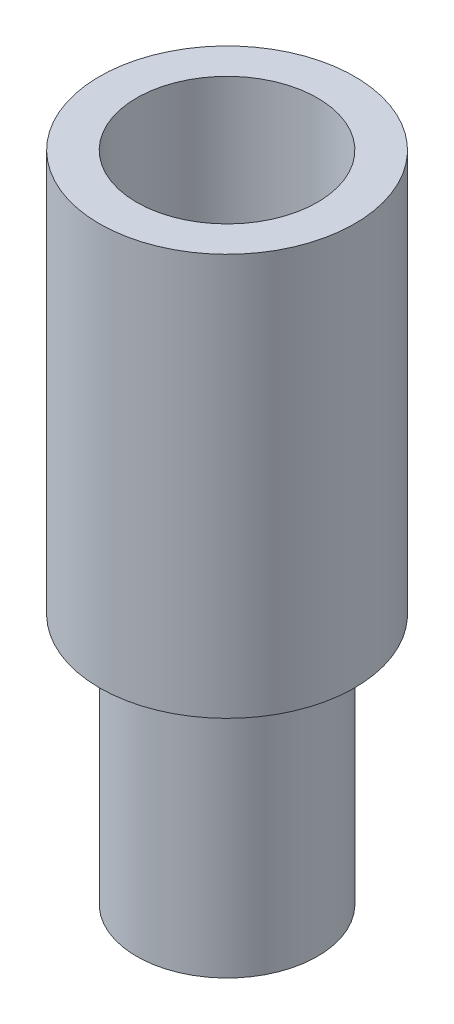
ISO-10303-21;
HEADER;
FILE_DESCRIPTION(('STEP AP214'),'2;1');
FILE_NAME('part.step','',(''),(''),'','','');
FILE_SCHEMA(('AUTOMOTIVE_DESIGN { 1 0 10303 214 1 1 1 1 }'));
ENDSEC;
DATA;
#1=APPLICATION_CONTEXT('core data for automotive mechanical design processes');
#2=APPLICATION_PROTOCOL_DEFINITION('international standard','automotive_design',2000,#1);
#3=PRODUCT_CONTEXT('',#1,'mechanical');
#4=PRODUCT('Part','Part','',(#3));
#5=PRODUCT_RELATED_PRODUCT_CATEGORY('part','',(#4));
#6=PRODUCT_DEFINITION_FORMATION('','',#4);
#7=PRODUCT_DEFINITION_CONTEXT('part definition',#1,'design');
#8=PRODUCT_DEFINITION('design','',#6,#7);
#9=PRODUCT_DEFINITION_SHAPE('','',#8);
#10=(LENGTH_UNIT() NAMED_UNIT(*) SI_UNIT(.MILLI.,.METRE.));
#11=(NAMED_UNIT(*) PLANE_ANGLE_UNIT() SI_UNIT($,.RADIAN.));
#12=(NAMED_UNIT(*) SI_UNIT($,.STERADIAN.) SOLID_ANGLE_UNIT());
#13=UNCERTAINTY_MEASURE_WITH_UNIT(LENGTH_MEASURE(1.E-05),#10,'distance_accuracy_value','');
#14=(GEOMETRIC_REPRESENTATION_CONTEXT(3) GLOBAL_UNCERTAINTY_ASSIGNED_CONTEXT((#13)) GLOBAL_UNIT_ASSIGNED_CONTEXT((#10,
#11,#12)) REPRESENTATION_CONTEXT('',''));
#15=CARTESIAN_POINT('',(0.,0.,0.));
#16=DIRECTION('',(0.,0.,1.));
#17=DIRECTION('',(1.,0.,0.));
#18=AXIS2_PLACEMENT_3D('',#15,#16,#17);
#19=CARTESIAN_POINT('',(0.,15.,0.));
#20=DIRECTION('',(0.,-1.,0.));
#21=DIRECTION('',(0.,0.,-1.));
#22=AXIS2_PLACEMENT_3D('',#19,#20,#21);
#23=CYLINDRICAL_SURFACE('',#22,12.7);
#24=CARTESIAN_POINT('',(0.,0.,0.));
#25=DIRECTION('',(0.,1.,0.));
#26=DIRECTION('',(0.,0.,1.));
#27=AXIS2_PLACEMENT_3D('',#24,#25,#26);
#28=CIRCLE('',#27,12.7);
#29=CARTESIAN_POINT('',(0.,0.,12.7));
#30=VERTEX_POINT('',#29);
#31=EDGE_CURVE('E53',#30,#30,#28,.T.);
#32=ORIENTED_EDGE('',*,*,#31,.T.);
#33=EDGE_LOOP('',(#32));
#34=FACE_BOUND('',#33,.T.);
#35=CARTESIAN_POINT('',(0.,40.,0.));
#36=DIRECTION('',(0.,1.,0.));
#37=DIRECTION('',(0.,0.,1.));
#38=AXIS2_PLACEMENT_3D('',#35,#36,#37);
#39=CIRCLE('',#38,12.7);
#40=CARTESIAN_POINT('',(0.,40.,12.7));
#41=VERTEX_POINT('',#40);
#42=EDGE_CURVE('E64',#41,#41,#39,.T.);
#43=ORIENTED_EDGE('',*,*,#42,.F.);
#44=EDGE_LOOP('',(#43));
#45=FACE_BOUND('',#44,.T.);
#46=ADVANCED_FACE('F41',(#34,#45),#23,.T.);
#47=CARTESIAN_POINT('',(0.,0.,0.));
#48=DIRECTION('',(0.,1.,0.));
#49=DIRECTION('',(0.,0.,1.));
#50=AXIS2_PLACEMENT_3D('',#47,#48,#49);
#51=PLANE('',#50);
#52=CARTESIAN_POINT('',(0.,0.,0.));
#53=DIRECTION('',(0.,-1.,0.));
#54=DIRECTION('',(0.,0.,-1.));
#55=AXIS2_PLACEMENT_3D('',#52,#53,#54);
#56=CIRCLE('',#55,9.);
#57=CARTESIAN_POINT('',(0.,0.,-9.));
#58=VERTEX_POINT('',#57);
#59=EDGE_CURVE('E48',#58,#58,#56,.T.);
#60=ORIENTED_EDGE('',*,*,#59,.F.);
#61=EDGE_LOOP('',(#60));
#62=FACE_BOUND('',#61,.T.);
#63=ORIENTED_EDGE('',*,*,#31,.F.);
#64=EDGE_LOOP('',(#63));
#65=FACE_BOUND('',#64,.T.);
#66=ADVANCED_FACE('F90',(#62,#65),#51,.F.);
#67=CARTESIAN_POINT('',(0.,-25.,0.));
#68=DIRECTION('',(0.,1.,0.));
#69=DIRECTION('',(0.,0.,1.));
#70=AXIS2_PLACEMENT_3D('',#67,#68,#69);
#71=CYLINDRICAL_SURFACE('',#70,9.);
#72=CARTESIAN_POINT('',(0.,-25.,0.));
#73=DIRECTION('',(0.,-1.,0.));
#74=DIRECTION('',(0.,0.,-1.));
#75=AXIS2_PLACEMENT_3D('',#72,#73,#74);
#76=CIRCLE('',#75,9.);
#77=CARTESIAN_POINT('',(0.,-25.,-9.));
#78=VERTEX_POINT('',#77);
#79=EDGE_CURVE('E59',#78,#78,#76,.T.);
#80=ORIENTED_EDGE('',*,*,#79,.F.);
#81=EDGE_LOOP('',(#80));
#82=FACE_BOUND('',#81,.T.);
#83=ORIENTED_EDGE('',*,*,#59,.T.);
#84=EDGE_LOOP('',(#83));
#85=FACE_BOUND('',#84,.T.);
#86=ADVANCED_FACE('F86',(#82,#85),#71,.T.);
#87=CARTESIAN_POINT('',(0.,-25.,0.));
#88=DIRECTION('',(0.,-1.,0.));
#89=DIRECTION('',(0.,0.,-1.));
#90=AXIS2_PLACEMENT_3D('',#87,#88,#89);
#91=PLANE('',#90);
#92=ORIENTED_EDGE('',*,*,#79,.T.);
#93=EDGE_LOOP('',(#92));
#94=FACE_BOUND('',#93,.T.);
#95=ADVANCED_FACE('F77',(#94),#91,.T.);
#96=CARTESIAN_POINT('',(0.,40.,0.));
#97=DIRECTION('',(0.,1.,0.));
#98=DIRECTION('',(0.,0.,1.));
#99=AXIS2_PLACEMENT_3D('',#96,#97,#98);
#100=PLANE('',#99);
#101=ORIENTED_EDGE('',*,*,#42,.T.);
#102=EDGE_LOOP('',(#101));
#103=FACE_BOUND('',#102,.T.);
#104=CARTESIAN_POINT('',(0.,40.,0.));
#105=DIRECTION('',(0.,1.,0.));
#106=DIRECTION('',(0.,0.,1.));
#107=AXIS2_PLACEMENT_3D('',#104,#105,#106);
#108=CIRCLE('',#107,9.);
#109=CARTESIAN_POINT('',(0.,40.,9.));
#110=VERTEX_POINT('',#109);
#111=EDGE_CURVE('E68',#110,#110,#108,.T.);
#112=ORIENTED_EDGE('',*,*,#111,.F.);
#113=EDGE_LOOP('',(#112));
#114=FACE_BOUND('',#113,.T.);
#115=ADVANCED_FACE('F75',(#103,#114),#100,.T.);
#116=CARTESIAN_POINT('',(0.,40.,0.));
#117=DIRECTION('',(0.,-1.,0.));
#118=DIRECTION('',(0.,0.,-1.));
#119=AXIS2_PLACEMENT_3D('',#116,#117,#118);
#120=CYLINDRICAL_SURFACE('',#119,9.);
#121=ORIENTED_EDGE('',*,*,#111,.T.);
#122=EDGE_LOOP('',(#121));
#123=FACE_BOUND('',#122,.T.);
#124=CARTESIAN_POINT('',(0.,15.,0.));
#125=DIRECTION('',(0.,1.,0.));
#126=DIRECTION('',(0.,0.,1.));
#127=AXIS2_PLACEMENT_3D('',#124,#125,#126);
#128=CIRCLE('',#127,9.);
#129=CARTESIAN_POINT('',(0.,15.,9.));
#130=VERTEX_POINT('',#129);
#131=EDGE_CURVE('E10',#130,#130,#128,.F.);
#132=ORIENTED_EDGE('',*,*,#131,.T.);
#133=EDGE_LOOP('',(#132));
#134=FACE_BOUND('',#133,.T.);
#135=ADVANCED_FACE('F73',(#123,#134),#120,.F.);
#136=CARTESIAN_POINT('',(0.,15.,0.));
#137=DIRECTION('',(0.,1.,0.));
#138=DIRECTION('',(0.,0.,1.));
#139=AXIS2_PLACEMENT_3D('',#136,#137,#138);
#140=PLANE('',#139);
#141=ORIENTED_EDGE('',*,*,#131,.F.);
#142=EDGE_LOOP('',(#141));
#143=FACE_BOUND('',#142,.T.);
#144=ADVANCED_FACE('F84',(#143),#140,.T.);
#145=CLOSED_SHELL('',(#46,#66,#86,#95,#115,#135,#144));
#146=MANIFOLD_SOLID_BREP('B2',#145);
#147=ADVANCED_BREP_SHAPE_REPRESENTATION('',(#18,#146),#14);
#148=SHAPE_DEFINITION_REPRESENTATION(#9,#147);
ENDSEC;
END-ISO-10303-21;
